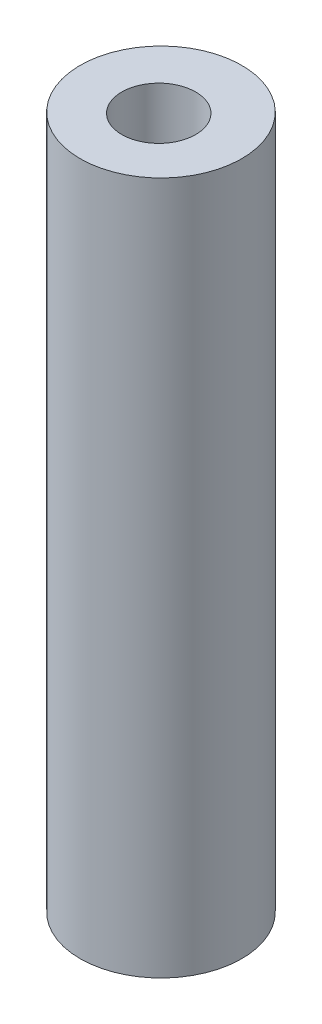
ISO-10303-21;
HEADER;
FILE_DESCRIPTION(('STEP AP214'),'2;1');
FILE_NAME('part.step','',(''),(''),'','','');
FILE_SCHEMA(('AUTOMOTIVE_DESIGN { 1 0 10303 214 1 1 1 1 }'));
ENDSEC;
DATA;
#1=APPLICATION_CONTEXT('core data for automotive mechanical design processes');
#2=APPLICATION_PROTOCOL_DEFINITION('international standard','automotive_design',2000,#1);
#3=PRODUCT_CONTEXT('',#1,'mechanical');
#4=PRODUCT('Part','Part','',(#3));
#5=PRODUCT_RELATED_PRODUCT_CATEGORY('part','',(#4));
#6=PRODUCT_DEFINITION_FORMATION('','',#4);
#7=PRODUCT_DEFINITION_CONTEXT('part definition',#1,'design');
#8=PRODUCT_DEFINITION('design','',#6,#7);
#9=PRODUCT_DEFINITION_SHAPE('','',#8);
#10=(LENGTH_UNIT() NAMED_UNIT(*) SI_UNIT(.MILLI.,.METRE.));
#11=(NAMED_UNIT(*) PLANE_ANGLE_UNIT() SI_UNIT($,.RADIAN.));
#12=(NAMED_UNIT(*) SI_UNIT($,.STERADIAN.) SOLID_ANGLE_UNIT());
#13=UNCERTAINTY_MEASURE_WITH_UNIT(LENGTH_MEASURE(1.E-05),#10,'distance_accuracy_value','');
#14=(GEOMETRIC_REPRESENTATION_CONTEXT(3) GLOBAL_UNCERTAINTY_ASSIGNED_CONTEXT((#13)) GLOBAL_UNIT_ASSIGNED_CONTEXT((#10,
#11,#12)) REPRESENTATION_CONTEXT('',''));
#15=CARTESIAN_POINT('',(0.,0.,0.));
#16=DIRECTION('',(0.,0.,1.));
#17=DIRECTION('',(1.,0.,0.));
#18=AXIS2_PLACEMENT_3D('',#15,#16,#17);
#19=CARTESIAN_POINT('',(0.,30.,0.));
#20=DIRECTION('',(0.,1.,0.));
#21=DIRECTION('',(0.,0.,1.));
#22=AXIS2_PLACEMENT_3D('',#19,#20,#21);
#23=PLANE('',#22);
#24=CARTESIAN_POINT('',(0.,30.,0.));
#25=DIRECTION('',(0.,1.,0.));
#26=DIRECTION('',(0.,0.,1.));
#27=AXIS2_PLACEMENT_3D('',#24,#25,#26);
#28=CIRCLE('',#27,3.5);
#29=CARTESIAN_POINT('',(0.,30.,3.5));
#30=VERTEX_POINT('',#29);
#31=EDGE_CURVE('E10',#30,#30,#28,.T.);
#32=ORIENTED_EDGE('',*,*,#31,.T.);
#33=EDGE_LOOP('',(#32));
#34=FACE_BOUND('',#33,.T.);
#35=CARTESIAN_POINT('',(0.,30.,0.0950731216757018));
#36=DIRECTION('',(0.,1.,0.));
#37=DIRECTION('',(0.,0.,1.));
#38=AXIS2_PLACEMENT_3D('',#35,#36,#37);
#39=CIRCLE('',#38,1.6);
#40=CARTESIAN_POINT('',(0.,30.,1.6950731216757));
#41=VERTEX_POINT('',#40);
#42=EDGE_CURVE('E48',#41,#41,#39,.T.);
#43=ORIENTED_EDGE('',*,*,#42,.F.);
#44=EDGE_LOOP('',(#43));
#45=FACE_BOUND('',#44,.T.);
#46=ADVANCED_FACE('F40',(#34,#45),#23,.T.);
#47=CARTESIAN_POINT('',(0.,0.,0.));
#48=DIRECTION('',(0.,1.,0.));
#49=DIRECTION('',(0.,0.,1.));
#50=AXIS2_PLACEMENT_3D('',#47,#48,#49);
#51=PLANE('',#50);
#52=CARTESIAN_POINT('',(0.,0.,0.));
#53=DIRECTION('',(0.,1.,0.));
#54=DIRECTION('',(0.,0.,1.));
#55=AXIS2_PLACEMENT_3D('',#52,#53,#54);
#56=CIRCLE('',#55,3.5);
#57=CARTESIAN_POINT('',(0.,0.,3.5));
#58=VERTEX_POINT('',#57);
#59=EDGE_CURVE('E41',#58,#58,#56,.T.);
#60=ORIENTED_EDGE('',*,*,#59,.F.);
#61=EDGE_LOOP('',(#60));
#62=FACE_BOUND('',#61,.T.);
#63=CARTESIAN_POINT('',(0.,0.,0.0950731216757018));
#64=DIRECTION('',(0.,1.,0.));
#65=DIRECTION('',(0.,0.,1.));
#66=AXIS2_PLACEMENT_3D('',#63,#64,#65);
#67=CIRCLE('',#66,1.6);
#68=CARTESIAN_POINT('',(0.,0.,1.6950731216757));
#69=VERTEX_POINT('',#68);
#70=EDGE_CURVE('E49',#69,#69,#67,.T.);
#71=ORIENTED_EDGE('',*,*,#70,.T.);
#72=EDGE_LOOP('',(#71));
#73=FACE_BOUND('',#72,.T.);
#74=ADVANCED_FACE('F58',(#62,#73),#51,.F.);
#75=CARTESIAN_POINT('',(0.,30.,0.));
#76=DIRECTION('',(0.,-1.,0.));
#77=DIRECTION('',(0.,0.,-1.));
#78=AXIS2_PLACEMENT_3D('',#75,#76,#77);
#79=CYLINDRICAL_SURFACE('',#78,3.5);
#80=ORIENTED_EDGE('',*,*,#31,.F.);
#81=EDGE_LOOP('',(#80));
#82=FACE_BOUND('',#81,.T.);
#83=ORIENTED_EDGE('',*,*,#59,.T.);
#84=EDGE_LOOP('',(#83));
#85=FACE_BOUND('',#84,.T.);
#86=ADVANCED_FACE('F39',(#82,#85),#79,.T.);
#87=CARTESIAN_POINT('',(0.,30.,0.0950731216757018));
#88=DIRECTION('',(0.,-1.,0.));
#89=DIRECTION('',(0.,0.,-1.));
#90=AXIS2_PLACEMENT_3D('',#87,#88,#89);
#91=CYLINDRICAL_SURFACE('',#90,1.6);
#92=ORIENTED_EDGE('',*,*,#42,.T.);
#93=EDGE_LOOP('',(#92));
#94=FACE_BOUND('',#93,.T.);
#95=ORIENTED_EDGE('',*,*,#70,.F.);
#96=EDGE_LOOP('',(#95));
#97=FACE_BOUND('',#96,.T.);
#98=ADVANCED_FACE('F57',(#94,#97),#91,.F.);
#99=CLOSED_SHELL('',(#46,#74,#86,#98));
#100=MANIFOLD_SOLID_BREP('B2',#99);
#101=ADVANCED_BREP_SHAPE_REPRESENTATION('',(#18,#100),#14);
#102=SHAPE_DEFINITION_REPRESENTATION(#9,#101);
ENDSEC;
END-ISO-10303-21;
